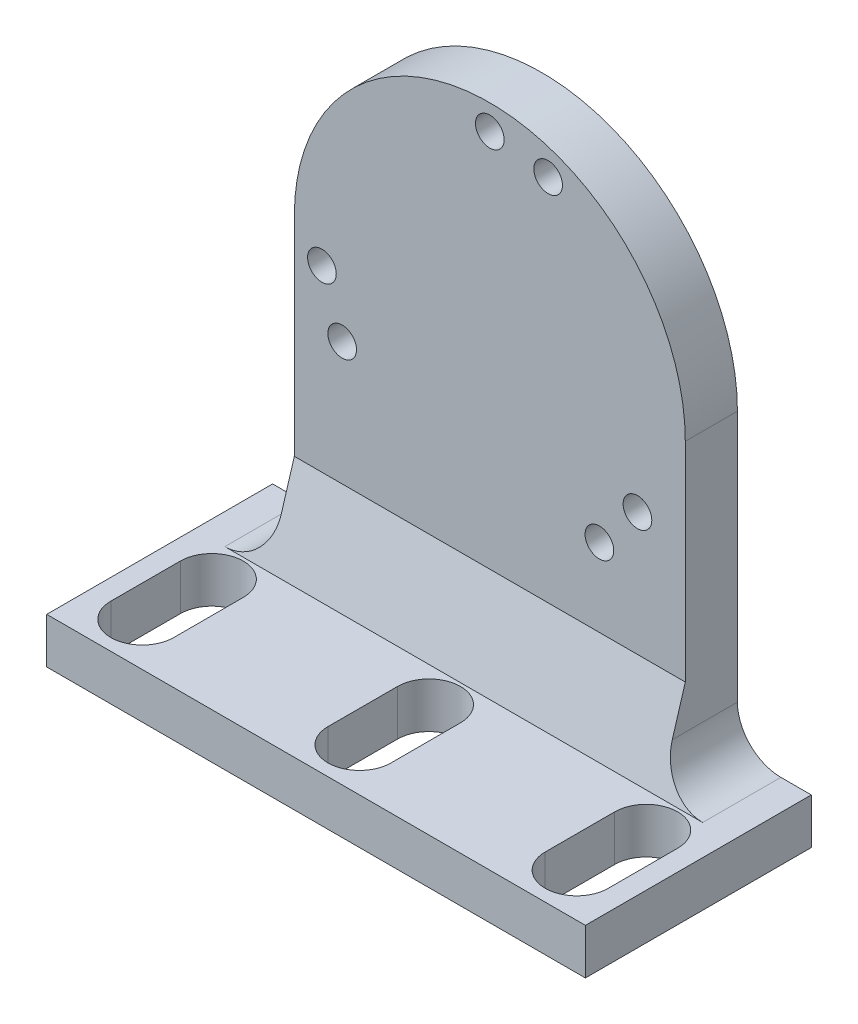
ISO-10303-21;
HEADER;
FILE_DESCRIPTION(('STEP AP214'),'2;1');
FILE_NAME('part.step','',(''),(''),'','','');
FILE_SCHEMA(('AUTOMOTIVE_DESIGN { 1 0 10303 214 1 1 1 1 }'));
ENDSEC;
DATA;
#1=APPLICATION_CONTEXT('core data for automotive mechanical design processes');
#2=APPLICATION_PROTOCOL_DEFINITION('international standard','automotive_design',2000,#1);
#3=PRODUCT_CONTEXT('',#1,'mechanical');
#4=PRODUCT('Part','Part','',(#3));
#5=PRODUCT_RELATED_PRODUCT_CATEGORY('part','',(#4));
#6=PRODUCT_DEFINITION_FORMATION('','',#4);
#7=PRODUCT_DEFINITION_CONTEXT('part definition',#1,'design');
#8=PRODUCT_DEFINITION('design','',#6,#7);
#9=PRODUCT_DEFINITION_SHAPE('','',#8);
#10=(LENGTH_UNIT() NAMED_UNIT(*) SI_UNIT(.MILLI.,.METRE.));
#11=(NAMED_UNIT(*) PLANE_ANGLE_UNIT() SI_UNIT($,.RADIAN.));
#12=(NAMED_UNIT(*) SI_UNIT($,.STERADIAN.) SOLID_ANGLE_UNIT());
#13=UNCERTAINTY_MEASURE_WITH_UNIT(LENGTH_MEASURE(1.E-05),#10,'distance_accuracy_value','');
#14=(GEOMETRIC_REPRESENTATION_CONTEXT(3) GLOBAL_UNCERTAINTY_ASSIGNED_CONTEXT((#13)) GLOBAL_UNIT_ASSIGNED_CONTEXT((#10,
#11,#12)) REPRESENTATION_CONTEXT('',''));
#15=CARTESIAN_POINT('',(0.,0.,0.));
#16=DIRECTION('',(0.,0.,1.));
#17=DIRECTION('',(1.,0.,0.));
#18=AXIS2_PLACEMENT_3D('',#15,#16,#17);
#19=CARTESIAN_POINT('',(0.,0.,6.));
#20=DIRECTION('',(0.,0.,1.));
#21=DIRECTION('',(1.,0.,0.));
#22=AXIS2_PLACEMENT_3D('',#19,#20,#21);
#23=PLANE('',#22);
#24=CARTESIAN_POINT('',(-19.3238977296041,-3.40732454218118,6.));
#25=DIRECTION('',(0.,0.,1.));
#26=DIRECTION('',(1.,0.,0.));
#27=AXIS2_PLACEMENT_3D('',#24,#25,#26);
#28=CIRCLE('',#27,1.65);
#29=CARTESIAN_POINT('',(-17.6738977296041,-3.40732454218118,6.));
#30=VERTEX_POINT('',#29);
#31=EDGE_CURVE('E208',#30,#30,#28,.T.);
#32=ORIENTED_EDGE('',*,*,#31,.F.);
#33=EDGE_LOOP('',(#32));
#34=FACE_BOUND('',#33,.T.);
#35=CARTESIAN_POINT('',(16.9931504730593,-9.81099999999897,6.));
#36=DIRECTION('',(0.,0.,1.));
#37=DIRECTION('',(1.,0.,0.));
#38=AXIS2_PLACEMENT_3D('',#35,#36,#37);
#39=CIRCLE('',#38,1.65);
#40=CARTESIAN_POINT('',(18.6431504730593,-9.81099999999897,6.));
#41=VERTEX_POINT('',#40);
#42=EDGE_CURVE('E211',#41,#41,#39,.F.);
#43=ORIENTED_EDGE('',*,*,#42,.T.);
#44=EDGE_LOOP('',(#43));
#45=FACE_BOUND('',#44,.T.);
#46=CARTESIAN_POINT('',(6.71111925233601,18.4386486050612,6.));
#47=DIRECTION('',(0.,0.,1.));
#48=DIRECTION('',(1.,0.,0.));
#49=AXIS2_PLACEMENT_3D('',#46,#47,#48);
#50=CIRCLE('',#49,1.65);
#51=CARTESIAN_POINT('',(8.36111925233601,18.4386486050612,6.));
#52=VERTEX_POINT('',#51);
#53=EDGE_CURVE('E219',#52,#52,#50,.T.);
#54=ORIENTED_EDGE('',*,*,#53,.F.);
#55=EDGE_LOOP('',(#54));
#56=FACE_BOUND('',#55,.T.);
#57=CARTESIAN_POINT('',(0.,19.622,6.));
#58=DIRECTION('',(0.,0.,1.));
#59=DIRECTION('',(1.,0.,0.));
#60=AXIS2_PLACEMENT_3D('',#57,#58,#59);
#61=CIRCLE('',#60,1.65000000000001);
#62=CARTESIAN_POINT('',(1.65,19.622,6.));
#63=VERTEX_POINT('',#62);
#64=EDGE_CURVE('E222',#63,#63,#61,.F.);
#65=ORIENTED_EDGE('',*,*,#64,.T.);
#66=EDGE_LOOP('',(#65));
#67=FACE_BOUND('',#66,.T.);
#68=CARTESIAN_POINT('',(12.6127784772705,-15.0313240628794,6.));
#69=DIRECTION('',(0.,0.,1.));
#70=DIRECTION('',(1.,0.,0.));
#71=AXIS2_PLACEMENT_3D('',#68,#69,#70);
#72=CIRCLE('',#71,1.65);
#73=CARTESIAN_POINT('',(14.2627784772705,-15.0313240628794,6.));
#74=VERTEX_POINT('',#73);
#75=EDGE_CURVE('E225',#74,#74,#72,.T.);
#76=ORIENTED_EDGE('',*,*,#75,.F.);
#77=EDGE_LOOP('',(#76));
#78=FACE_BOUND('',#77,.T.);
#79=CARTESIAN_POINT('',(-16.9931504730568,-9.8110000000004,6.));
#80=DIRECTION('',(0.,0.,1.));
#81=DIRECTION('',(1.,0.,0.));
#82=AXIS2_PLACEMENT_3D('',#79,#80,#81);
#83=CIRCLE('',#82,1.65);
#84=CARTESIAN_POINT('',(-15.3431504730568,-9.8110000000004,6.));
#85=VERTEX_POINT('',#84);
#86=EDGE_CURVE('E228',#85,#85,#83,.F.);
#87=ORIENTED_EDGE('',*,*,#86,.T.);
#88=EDGE_LOOP('',(#87));
#89=FACE_BOUND('',#88,.T.);
#90=DIRECTION('',(0.,1.,0.));
#91=VECTOR('',#90,1.);
#92=CARTESIAN_POINT('',(-22.5,0.,6.));
#93=LINE('',#92,#91);
#94=CARTESIAN_POINT('',(-22.5,-24.,6.));
#95=VERTEX_POINT('',#94);
#96=CARTESIAN_POINT('',(-22.5,0.,6.));
#97=VERTEX_POINT('',#96);
#98=EDGE_CURVE('E201',#95,#97,#93,.T.);
#99=ORIENTED_EDGE('',*,*,#98,.F.);
#100=DIRECTION('',(-1.,0.,0.));
#101=VECTOR('',#100,1.);
#102=CARTESIAN_POINT('',(22.5,-24.,6.));
#103=LINE('',#102,#101);
#104=CARTESIAN_POINT('',(22.5,-24.,6.));
#105=VERTEX_POINT('',#104);
#106=EDGE_CURVE('E190',#105,#95,#103,.T.);
#107=ORIENTED_EDGE('',*,*,#106,.F.);
#108=DIRECTION('',(0.,1.,0.));
#109=VECTOR('',#108,1.);
#110=CARTESIAN_POINT('',(22.5,0.,6.));
#111=LINE('',#110,#109);
#112=CARTESIAN_POINT('',(22.5,0.,6.));
#113=VERTEX_POINT('',#112);
#114=EDGE_CURVE('E199',#105,#113,#111,.T.);
#115=ORIENTED_EDGE('',*,*,#114,.T.);
#116=CARTESIAN_POINT('',(0.,0.,6.));
#117=DIRECTION('',(0.,0.,1.));
#118=DIRECTION('',(1.,0.,0.));
#119=AXIS2_PLACEMENT_3D('',#116,#117,#118);
#120=CIRCLE('',#119,22.5);
#121=EDGE_CURVE('E213',#97,#113,#120,.F.);
#122=ORIENTED_EDGE('',*,*,#121,.F.);
#123=EDGE_LOOP('',(#99,#107,#115,#122));
#124=FACE_BOUND('',#123,.T.);
#125=ADVANCED_FACE('F35',(#34,#45,#56,#67,#78,#89,#124),#23,.T.);
#126=CARTESIAN_POINT('',(31.,-34.,26.));
#127=DIRECTION('',(0.,-1.,0.));
#128=DIRECTION('',(1.,0.,0.));
#129=AXIS2_PLACEMENT_3D('',#126,#127,#128);
#130=PLANE('',#129);
#131=DIRECTION('',(0.,0.,-1.));
#132=VECTOR('',#131,1.);
#133=CARTESIAN_POINT('',(3.625,-34.,21.));
#134=LINE('',#133,#132);
#135=CARTESIAN_POINT('',(3.625,-34.,21.));
#136=VERTEX_POINT('',#135);
#137=CARTESIAN_POINT('',(3.625,-34.,13.));
#138=VERTEX_POINT('',#137);
#139=EDGE_CURVE('E343',#136,#138,#134,.T.);
#140=ORIENTED_EDGE('',*,*,#139,.F.);
#141=CARTESIAN_POINT('',(0.,-34.,21.));
#142=DIRECTION('',(0.,1.,0.));
#143=DIRECTION('',(-1.,0.,0.));
#144=AXIS2_PLACEMENT_3D('',#141,#142,#143);
#145=CIRCLE('',#144,3.625);
#146=CARTESIAN_POINT('',(-3.625,-34.,21.));
#147=VERTEX_POINT('',#146);
#148=EDGE_CURVE('E346',#147,#136,#145,.T.);
#149=ORIENTED_EDGE('',*,*,#148,.F.);
#150=DIRECTION('',(0.,0.,1.));
#151=VECTOR('',#150,1.);
#152=CARTESIAN_POINT('',(-3.625,-34.,21.));
#153=LINE('',#152,#151);
#154=CARTESIAN_POINT('',(-3.625,-34.,13.));
#155=VERTEX_POINT('',#154);
#156=EDGE_CURVE('E336',#155,#147,#153,.T.);
#157=ORIENTED_EDGE('',*,*,#156,.F.);
#158=CARTESIAN_POINT('',(0.,-34.,13.));
#159=DIRECTION('',(0.,1.,0.));
#160=DIRECTION('',(-1.,0.,0.));
#161=AXIS2_PLACEMENT_3D('',#158,#159,#160);
#162=CIRCLE('',#161,3.625);
#163=EDGE_CURVE('E340',#138,#155,#162,.T.);
#164=ORIENTED_EDGE('',*,*,#163,.F.);
#165=EDGE_LOOP('',(#140,#149,#157,#164));
#166=FACE_BOUND('',#165,.T.);
#167=DIRECTION('',(0.,0.,-1.));
#168=VECTOR('',#167,1.);
#169=CARTESIAN_POINT('',(-21.375,-34.,21.));
#170=LINE('',#169,#168);
#171=CARTESIAN_POINT('',(-21.375,-34.,21.));
#172=VERTEX_POINT('',#171);
#173=CARTESIAN_POINT('',(-21.375,-34.,13.));
#174=VERTEX_POINT('',#173);
#175=EDGE_CURVE('E377',#172,#174,#170,.T.);
#176=ORIENTED_EDGE('',*,*,#175,.F.);
#177=CARTESIAN_POINT('',(-25.,-34.,21.));
#178=DIRECTION('',(0.,1.,0.));
#179=DIRECTION('',(-1.,0.,0.));
#180=AXIS2_PLACEMENT_3D('',#177,#178,#179);
#181=CIRCLE('',#180,3.62500000000001);
#182=CARTESIAN_POINT('',(-28.625,-34.,21.));
#183=VERTEX_POINT('',#182);
#184=EDGE_CURVE('E202',#183,#172,#181,.T.);
#185=ORIENTED_EDGE('',*,*,#184,.F.);
#186=DIRECTION('',(0.,0.,1.));
#187=VECTOR('',#186,1.);
#188=CARTESIAN_POINT('',(-28.625,-34.,21.));
#189=LINE('',#188,#187);
#190=CARTESIAN_POINT('',(-28.625,-34.,13.));
#191=VERTEX_POINT('',#190);
#192=EDGE_CURVE('E370',#191,#183,#189,.T.);
#193=ORIENTED_EDGE('',*,*,#192,.F.);
#194=CARTESIAN_POINT('',(-25.,-34.,13.));
#195=DIRECTION('',(0.,1.,0.));
#196=DIRECTION('',(-1.,0.,0.));
#197=AXIS2_PLACEMENT_3D('',#194,#195,#196);
#198=CIRCLE('',#197,3.62500000000001);
#199=EDGE_CURVE('E374',#174,#191,#198,.T.);
#200=ORIENTED_EDGE('',*,*,#199,.F.);
#201=EDGE_LOOP('',(#176,#185,#193,#200));
#202=FACE_BOUND('',#201,.T.);
#203=DIRECTION('',(0.,0.,-1.));
#204=VECTOR('',#203,1.);
#205=CARTESIAN_POINT('',(28.625,-34.,21.));
#206=LINE('',#205,#204);
#207=CARTESIAN_POINT('',(28.625,-34.,21.));
#208=VERTEX_POINT('',#207);
#209=CARTESIAN_POINT('',(28.625,-34.,13.));
#210=VERTEX_POINT('',#209);
#211=EDGE_CURVE('E407',#208,#210,#206,.T.);
#212=ORIENTED_EDGE('',*,*,#211,.F.);
#213=CARTESIAN_POINT('',(25.,-34.,21.));
#214=DIRECTION('',(0.,1.,0.));
#215=DIRECTION('',(-1.,0.,0.));
#216=AXIS2_PLACEMENT_3D('',#213,#214,#215);
#217=CIRCLE('',#216,3.625);
#218=CARTESIAN_POINT('',(21.375,-34.,21.));
#219=VERTEX_POINT('',#218);
#220=EDGE_CURVE('E369',#219,#208,#217,.T.);
#221=ORIENTED_EDGE('',*,*,#220,.F.);
#222=DIRECTION('',(0.,0.,1.));
#223=VECTOR('',#222,1.);
#224=CARTESIAN_POINT('',(21.375,-34.,21.));
#225=LINE('',#224,#223);
#226=CARTESIAN_POINT('',(21.375,-34.,13.));
#227=VERTEX_POINT('',#226);
#228=EDGE_CURVE('E400',#227,#219,#225,.T.);
#229=ORIENTED_EDGE('',*,*,#228,.F.);
#230=CARTESIAN_POINT('',(25.,-34.,13.));
#231=DIRECTION('',(0.,1.,0.));
#232=DIRECTION('',(-1.,0.,0.));
#233=AXIS2_PLACEMENT_3D('',#230,#231,#232);
#234=CIRCLE('',#233,3.625);
#235=EDGE_CURVE('E404',#210,#227,#234,.T.);
#236=ORIENTED_EDGE('',*,*,#235,.F.);
#237=EDGE_LOOP('',(#212,#221,#229,#236));
#238=FACE_BOUND('',#237,.T.);
#239=DIRECTION('',(-1.,0.,0.));
#240=VECTOR('',#239,1.);
#241=CARTESIAN_POINT('',(22.5,-34.,9.));
#242=LINE('',#241,#240);
#243=CARTESIAN_POINT('',(27.5,-34.,9.));
#244=VERTEX_POINT('',#243);
#245=CARTESIAN_POINT('',(-27.5,-34.,9.));
#246=VERTEX_POINT('',#245);
#247=EDGE_CURVE('E194',#244,#246,#242,.T.);
#248=ORIENTED_EDGE('',*,*,#247,.T.);
#249=DIRECTION('',(0.,0.,-1.));
#250=VECTOR('',#249,1.);
#251=CARTESIAN_POINT('',(-27.5,-34.,26.));
#252=LINE('',#251,#250);
#253=CARTESIAN_POINT('',(-27.5,-34.,0.));
#254=VERTEX_POINT('',#253);
#255=EDGE_CURVE('E264',#246,#254,#252,.T.);
#256=ORIENTED_EDGE('',*,*,#255,.T.);
#257=DIRECTION('',(-1.,0.,0.));
#258=VECTOR('',#257,1.);
#259=CARTESIAN_POINT('',(31.,-34.,0.));
#260=LINE('',#259,#258);
#261=CARTESIAN_POINT('',(-31.,-34.,0.));
#262=VERTEX_POINT('',#261);
#263=EDGE_CURVE('E290',#254,#262,#260,.T.);
#264=ORIENTED_EDGE('',*,*,#263,.T.);
#265=DIRECTION('',(0.,0.,-1.));
#266=VECTOR('',#265,1.);
#267=CARTESIAN_POINT('',(-31.,-34.,26.));
#268=LINE('',#267,#266);
#269=CARTESIAN_POINT('',(-31.,-34.,26.));
#270=VERTEX_POINT('',#269);
#271=EDGE_CURVE('E308',#270,#262,#268,.T.);
#272=ORIENTED_EDGE('',*,*,#271,.F.);
#273=DIRECTION('',(-1.,0.,0.));
#274=VECTOR('',#273,1.);
#275=CARTESIAN_POINT('',(31.,-34.,26.));
#276=LINE('',#275,#274);
#277=CARTESIAN_POINT('',(31.,-34.,26.));
#278=VERTEX_POINT('',#277);
#279=EDGE_CURVE('E310',#278,#270,#276,.T.);
#280=ORIENTED_EDGE('',*,*,#279,.F.);
#281=DIRECTION('',(0.,0.,-1.));
#282=VECTOR('',#281,1.);
#283=CARTESIAN_POINT('',(31.,-34.,26.));
#284=LINE('',#283,#282);
#285=CARTESIAN_POINT('',(31.,-34.,0.));
#286=VERTEX_POINT('',#285);
#287=EDGE_CURVE('E288',#278,#286,#284,.T.);
#288=ORIENTED_EDGE('',*,*,#287,.T.);
#289=CARTESIAN_POINT('',(27.5,-34.,0.));
#290=VERTEX_POINT('',#289);
#291=EDGE_CURVE('E282',#286,#290,#260,.T.);
#292=ORIENTED_EDGE('',*,*,#291,.T.);
#293=DIRECTION('',(0.,0.,-1.));
#294=VECTOR('',#293,1.);
#295=CARTESIAN_POINT('',(27.5,-34.,9.));
#296=LINE('',#295,#294);
#297=EDGE_CURVE('E261',#290,#244,#296,.F.);
#298=ORIENTED_EDGE('',*,*,#297,.T.);
#299=EDGE_LOOP('',(#248,#256,#264,#272,#280,#288,#292,#298));
#300=FACE_BOUND('',#299,.T.);
#301=ADVANCED_FACE('F285',(#166,#202,#238,#300),#130,.F.);
#302=CARTESIAN_POINT('',(0.,0.,6.));
#303=DIRECTION('',(0.,0.,-1.));
#304=DIRECTION('',(-1.,0.,0.));
#305=AXIS2_PLACEMENT_3D('',#302,#303,#304);
#306=CYLINDRICAL_SURFACE('',#305,22.5);
#307=CARTESIAN_POINT('',(0.,0.,0.));
#308=DIRECTION('',(0.,0.,1.));
#309=DIRECTION('',(1.,0.,0.));
#310=AXIS2_PLACEMENT_3D('',#307,#308,#309);
#311=CIRCLE('',#310,22.5);
#312=CARTESIAN_POINT('',(-22.5,0.,0.));
#313=VERTEX_POINT('',#312);
#314=CARTESIAN_POINT('',(22.5,0.,0.));
#315=VERTEX_POINT('',#314);
#316=EDGE_CURVE('E231',#313,#315,#311,.F.);
#317=ORIENTED_EDGE('',*,*,#316,.F.);
#318=DIRECTION('',(0.,0.,-1.));
#319=VECTOR('',#318,1.);
#320=CARTESIAN_POINT('',(-22.5,0.,6.));
#321=LINE('',#320,#319);
#322=EDGE_CURVE('E258',#97,#313,#321,.T.);
#323=ORIENTED_EDGE('',*,*,#322,.F.);
#324=ORIENTED_EDGE('',*,*,#121,.T.);
#325=DIRECTION('',(0.,0.,-1.));
#326=VECTOR('',#325,1.);
#327=CARTESIAN_POINT('',(22.5,0.,6.));
#328=LINE('',#327,#326);
#329=EDGE_CURVE('E206',#113,#315,#328,.T.);
#330=ORIENTED_EDGE('',*,*,#329,.T.);
#331=EDGE_LOOP('',(#317,#323,#324,#330));
#332=FACE_BOUND('',#331,.T.);
#333=ADVANCED_FACE('F294',(#332),#306,.T.);
#334=CARTESIAN_POINT('',(-22.5,0.,6.));
#335=DIRECTION('',(-1.,0.,0.));
#336=DIRECTION('',(0.,0.,1.));
#337=AXIS2_PLACEMENT_3D('',#334,#335,#336);
#338=PLANE('',#337);
#339=DIRECTION('',(0.,1.,0.));
#340=VECTOR('',#339,1.);
#341=CARTESIAN_POINT('',(-22.5,0.,0.));
#342=LINE('',#341,#340);
#343=CARTESIAN_POINT('',(-22.5,-29.,0.));
#344=VERTEX_POINT('',#343);
#345=EDGE_CURVE('E234',#344,#313,#342,.T.);
#346=ORIENTED_EDGE('',*,*,#345,.F.);
#347=DIRECTION('',(0.,0.,-1.));
#348=VECTOR('',#347,1.);
#349=CARTESIAN_POINT('',(-22.5,-29.,6.));
#350=LINE('',#349,#348);
#351=CARTESIAN_POINT('',(-22.5,-29.,7.5));
#352=VERTEX_POINT('',#351);
#353=EDGE_CURVE('E267',#344,#352,#350,.F.);
#354=ORIENTED_EDGE('',*,*,#353,.T.);
#355=DIRECTION('',(0.,-0.957826285221151,0.287347885566345));
#356=VECTOR('',#355,1.);
#357=CARTESIAN_POINT('',(-22.5,-24.,6.));
#358=LINE('',#357,#356);
#359=EDGE_CURVE('E195',#95,#352,#358,.T.);
#360=ORIENTED_EDGE('',*,*,#359,.F.);
#361=ORIENTED_EDGE('',*,*,#98,.T.);
#362=ORIENTED_EDGE('',*,*,#322,.T.);
#363=EDGE_LOOP('',(#346,#354,#360,#361,#362));
#364=FACE_BOUND('',#363,.T.);
#365=ADVANCED_FACE('F300',(#364),#338,.T.);
#366=CARTESIAN_POINT('',(12.6127784772705,-15.0313240628794,6.));
#367=DIRECTION('',(0.,0.,-1.));
#368=DIRECTION('',(-1.,0.,0.));
#369=AXIS2_PLACEMENT_3D('',#366,#367,#368);
#370=CYLINDRICAL_SURFACE('',#369,1.65);
#371=ORIENTED_EDGE('',*,*,#75,.T.);
#372=EDGE_LOOP('',(#371));
#373=FACE_BOUND('',#372,.T.);
#374=CARTESIAN_POINT('',(12.6127784772705,-15.0313240628794,0.));
#375=DIRECTION('',(0.,0.,1.));
#376=DIRECTION('',(1.,0.,0.));
#377=AXIS2_PLACEMENT_3D('',#374,#375,#376);
#378=CIRCLE('',#377,1.65);
#379=CARTESIAN_POINT('',(14.2627784772705,-15.0313240628794,0.));
#380=VERTEX_POINT('',#379);
#381=EDGE_CURVE('E251',#380,#380,#378,.T.);
#382=ORIENTED_EDGE('',*,*,#381,.F.);
#383=EDGE_LOOP('',(#382));
#384=FACE_BOUND('',#383,.T.);
#385=ADVANCED_FACE('F467',(#373,#384),#370,.F.);
#386=CARTESIAN_POINT('',(0.,19.622,6.));
#387=DIRECTION('',(0.,0.,-1.));
#388=DIRECTION('',(-1.,0.,0.));
#389=AXIS2_PLACEMENT_3D('',#386,#387,#388);
#390=CYLINDRICAL_SURFACE('',#389,1.65000000000001);
#391=ORIENTED_EDGE('',*,*,#64,.F.);
#392=EDGE_LOOP('',(#391));
#393=FACE_BOUND('',#392,.T.);
#394=CARTESIAN_POINT('',(0.,19.622,0.));
#395=DIRECTION('',(0.,0.,1.));
#396=DIRECTION('',(1.,0.,0.));
#397=AXIS2_PLACEMENT_3D('',#394,#395,#396);
#398=CIRCLE('',#397,1.65000000000001);
#399=CARTESIAN_POINT('',(1.65,19.622,0.));
#400=VERTEX_POINT('',#399);
#401=EDGE_CURVE('E248',#400,#400,#398,.F.);
#402=ORIENTED_EDGE('',*,*,#401,.T.);
#403=EDGE_LOOP('',(#402));
#404=FACE_BOUND('',#403,.T.);
#405=ADVANCED_FACE('F470',(#393,#404),#390,.F.);
#406=CARTESIAN_POINT('',(6.71111925233601,18.4386486050612,6.));
#407=DIRECTION('',(0.,0.,-1.));
#408=DIRECTION('',(-1.,0.,0.));
#409=AXIS2_PLACEMENT_3D('',#406,#407,#408);
#410=CYLINDRICAL_SURFACE('',#409,1.65);
#411=ORIENTED_EDGE('',*,*,#53,.T.);
#412=EDGE_LOOP('',(#411));
#413=FACE_BOUND('',#412,.T.);
#414=CARTESIAN_POINT('',(6.71111925233601,18.4386486050612,0.));
#415=DIRECTION('',(0.,0.,1.));
#416=DIRECTION('',(1.,0.,0.));
#417=AXIS2_PLACEMENT_3D('',#414,#415,#416);
#418=CIRCLE('',#417,1.65);
#419=CARTESIAN_POINT('',(8.36111925233601,18.4386486050612,0.));
#420=VERTEX_POINT('',#419);
#421=EDGE_CURVE('E245',#420,#420,#418,.T.);
#422=ORIENTED_EDGE('',*,*,#421,.F.);
#423=EDGE_LOOP('',(#422));
#424=FACE_BOUND('',#423,.T.);
#425=ADVANCED_FACE('F474',(#413,#424),#410,.F.);
#426=CARTESIAN_POINT('',(16.9931504730593,-9.81099999999897,6.));
#427=DIRECTION('',(0.,0.,-1.));
#428=DIRECTION('',(-1.,0.,0.));
#429=AXIS2_PLACEMENT_3D('',#426,#427,#428);
#430=CYLINDRICAL_SURFACE('',#429,1.65);
#431=ORIENTED_EDGE('',*,*,#42,.F.);
#432=EDGE_LOOP('',(#431));
#433=FACE_BOUND('',#432,.T.);
#434=CARTESIAN_POINT('',(16.9931504730593,-9.81099999999897,0.));
#435=DIRECTION('',(0.,0.,1.));
#436=DIRECTION('',(1.,0.,0.));
#437=AXIS2_PLACEMENT_3D('',#434,#435,#436);
#438=CIRCLE('',#437,1.65);
#439=CARTESIAN_POINT('',(18.6431504730593,-9.81099999999897,0.));
#440=VERTEX_POINT('',#439);
#441=EDGE_CURVE('E242',#440,#440,#438,.F.);
#442=ORIENTED_EDGE('',*,*,#441,.T.);
#443=EDGE_LOOP('',(#442));
#444=FACE_BOUND('',#443,.T.);
#445=ADVANCED_FACE('F478',(#433,#444),#430,.F.);
#446=CARTESIAN_POINT('',(-19.3238977296041,-3.40732454218118,6.));
#447=DIRECTION('',(0.,0.,-1.));
#448=DIRECTION('',(-1.,0.,0.));
#449=AXIS2_PLACEMENT_3D('',#446,#447,#448);
#450=CYLINDRICAL_SURFACE('',#449,1.65);
#451=ORIENTED_EDGE('',*,*,#31,.T.);
#452=EDGE_LOOP('',(#451));
#453=FACE_BOUND('',#452,.T.);
#454=CARTESIAN_POINT('',(-19.3238977296041,-3.40732454218118,0.));
#455=DIRECTION('',(0.,0.,1.));
#456=DIRECTION('',(1.,0.,0.));
#457=AXIS2_PLACEMENT_3D('',#454,#455,#456);
#458=CIRCLE('',#457,1.65);
#459=CARTESIAN_POINT('',(-17.6738977296041,-3.40732454218118,0.));
#460=VERTEX_POINT('',#459);
#461=EDGE_CURVE('E239',#460,#460,#458,.T.);
#462=ORIENTED_EDGE('',*,*,#461,.F.);
#463=EDGE_LOOP('',(#462));
#464=FACE_BOUND('',#463,.T.);
#465=ADVANCED_FACE('F482',(#453,#464),#450,.F.);
#466=CARTESIAN_POINT('',(22.5,0.,6.));
#467=DIRECTION('',(-1.,0.,0.));
#468=DIRECTION('',(0.,-1.,0.));
#469=AXIS2_PLACEMENT_3D('',#466,#467,#468);
#470=PLANE('',#469);
#471=DIRECTION('',(0.,-0.957826285221151,0.287347885566345));
#472=VECTOR('',#471,1.);
#473=CARTESIAN_POINT('',(22.5,-24.,6.));
#474=LINE('',#473,#472);
#475=CARTESIAN_POINT('',(22.5,-29.,7.5));
#476=VERTEX_POINT('',#475);
#477=EDGE_CURVE('E186',#105,#476,#474,.T.);
#478=ORIENTED_EDGE('',*,*,#477,.T.);
#479=DIRECTION('',(0.,0.,-1.));
#480=VECTOR('',#479,1.);
#481=CARTESIAN_POINT('',(22.5,-29.,0.));
#482=LINE('',#481,#480);
#483=CARTESIAN_POINT('',(22.5,-29.,0.));
#484=VERTEX_POINT('',#483);
#485=EDGE_CURVE('E269',#476,#484,#482,.T.);
#486=ORIENTED_EDGE('',*,*,#485,.T.);
#487=DIRECTION('',(0.,1.,0.));
#488=VECTOR('',#487,1.);
#489=CARTESIAN_POINT('',(22.5,0.,0.));
#490=LINE('',#489,#488);
#491=EDGE_CURVE('E237',#484,#315,#490,.T.);
#492=ORIENTED_EDGE('',*,*,#491,.T.);
#493=ORIENTED_EDGE('',*,*,#329,.F.);
#494=ORIENTED_EDGE('',*,*,#114,.F.);
#495=EDGE_LOOP('',(#478,#486,#492,#493,#494));
#496=FACE_BOUND('',#495,.T.);
#497=ADVANCED_FACE('F204',(#496),#470,.F.);
#498=CARTESIAN_POINT('',(-16.9931504730568,-9.8110000000004,6.));
#499=DIRECTION('',(0.,0.,-1.));
#500=DIRECTION('',(-1.,0.,0.));
#501=AXIS2_PLACEMENT_3D('',#498,#499,#500);
#502=CYLINDRICAL_SURFACE('',#501,1.65);
#503=ORIENTED_EDGE('',*,*,#86,.F.);
#504=EDGE_LOOP('',(#503));
#505=FACE_BOUND('',#504,.T.);
#506=CARTESIAN_POINT('',(-16.9931504730568,-9.8110000000004,0.));
#507=DIRECTION('',(0.,0.,1.));
#508=DIRECTION('',(1.,0.,0.));
#509=AXIS2_PLACEMENT_3D('',#506,#507,#508);
#510=CIRCLE('',#509,1.65);
#511=CARTESIAN_POINT('',(-15.3431504730568,-9.8110000000004,0.));
#512=VERTEX_POINT('',#511);
#513=EDGE_CURVE('E254',#512,#512,#510,.F.);
#514=ORIENTED_EDGE('',*,*,#513,.T.);
#515=EDGE_LOOP('',(#514));
#516=FACE_BOUND('',#515,.T.);
#517=ADVANCED_FACE('F463',(#505,#516),#502,.F.);
#518=CARTESIAN_POINT('',(0.,0.,0.));
#519=DIRECTION('',(0.,0.,1.));
#520=DIRECTION('',(1.,0.,0.));
#521=AXIS2_PLACEMENT_3D('',#518,#519,#520);
#522=PLANE('',#521);
#523=ORIENTED_EDGE('',*,*,#316,.T.);
#524=ORIENTED_EDGE('',*,*,#491,.F.);
#525=CARTESIAN_POINT('',(27.5,-29.,0.));
#526=DIRECTION('',(0.,0.,1.));
#527=DIRECTION('',(1.,0.,0.));
#528=AXIS2_PLACEMENT_3D('',#525,#526,#527);
#529=CIRCLE('',#528,5.);
#530=EDGE_CURVE('E43',#484,#290,#529,.T.);
#531=ORIENTED_EDGE('',*,*,#530,.T.);
#532=ORIENTED_EDGE('',*,*,#291,.F.);
#533=DIRECTION('',(0.,1.,0.));
#534=VECTOR('',#533,1.);
#535=CARTESIAN_POINT('',(31.,-39.25,0.));
#536=LINE('',#535,#534);
#537=CARTESIAN_POINT('',(31.,-39.25,0.));
#538=VERTEX_POINT('',#537);
#539=EDGE_CURVE('E312',#538,#286,#536,.T.);
#540=ORIENTED_EDGE('',*,*,#539,.F.);
#541=DIRECTION('',(1.,0.,0.));
#542=VECTOR('',#541,1.);
#543=CARTESIAN_POINT('',(31.,-39.25,0.));
#544=LINE('',#543,#542);
#545=CARTESIAN_POINT('',(-31.,-39.25,0.));
#546=VERTEX_POINT('',#545);
#547=EDGE_CURVE('E314',#546,#538,#544,.T.);
#548=ORIENTED_EDGE('',*,*,#547,.F.);
#549=DIRECTION('',(0.,-1.,0.));
#550=VECTOR('',#549,1.);
#551=CARTESIAN_POINT('',(-31.,-39.25,0.));
#552=LINE('',#551,#550);
#553=EDGE_CURVE('E316',#262,#546,#552,.T.);
#554=ORIENTED_EDGE('',*,*,#553,.F.);
#555=ORIENTED_EDGE('',*,*,#263,.F.);
#556=CARTESIAN_POINT('',(-27.5,-29.,0.));
#557=DIRECTION('',(0.,0.,1.));
#558=DIRECTION('',(1.,0.,0.));
#559=AXIS2_PLACEMENT_3D('',#556,#557,#558);
#560=CIRCLE('',#559,5.);
#561=EDGE_CURVE('E271',#254,#344,#560,.T.);
#562=ORIENTED_EDGE('',*,*,#561,.T.);
#563=ORIENTED_EDGE('',*,*,#345,.T.);
#564=EDGE_LOOP('',(#523,#524,#531,#532,#540,#548,#554,#555,#562,#563));
#565=FACE_BOUND('',#564,.T.);
#566=ORIENTED_EDGE('',*,*,#461,.T.);
#567=EDGE_LOOP('',(#566));
#568=FACE_BOUND('',#567,.T.);
#569=ORIENTED_EDGE('',*,*,#441,.F.);
#570=EDGE_LOOP('',(#569));
#571=FACE_BOUND('',#570,.T.);
#572=ORIENTED_EDGE('',*,*,#421,.T.);
#573=EDGE_LOOP('',(#572));
#574=FACE_BOUND('',#573,.T.);
#575=ORIENTED_EDGE('',*,*,#401,.F.);
#576=EDGE_LOOP('',(#575));
#577=FACE_BOUND('',#576,.T.);
#578=ORIENTED_EDGE('',*,*,#381,.T.);
#579=EDGE_LOOP('',(#578));
#580=FACE_BOUND('',#579,.T.);
#581=ORIENTED_EDGE('',*,*,#513,.F.);
#582=EDGE_LOOP('',(#581));
#583=FACE_BOUND('',#582,.T.);
#584=ADVANCED_FACE('F279',(#565,#568,#571,#574,#577,#580,#583),#522,.F.);
#585=CARTESIAN_POINT('',(-31.,-39.25,26.));
#586=DIRECTION('',(1.,0.,0.));
#587=DIRECTION('',(0.,0.,-1.));
#588=AXIS2_PLACEMENT_3D('',#585,#586,#587);
#589=PLANE('',#588);
#590=ORIENTED_EDGE('',*,*,#553,.T.);
#591=DIRECTION('',(0.,0.,-1.));
#592=VECTOR('',#591,1.);
#593=CARTESIAN_POINT('',(-31.,-39.25,26.));
#594=LINE('',#593,#592);
#595=CARTESIAN_POINT('',(-31.,-39.25,26.));
#596=VERTEX_POINT('',#595);
#597=EDGE_CURVE('E235',#596,#546,#594,.T.);
#598=ORIENTED_EDGE('',*,*,#597,.F.);
#599=DIRECTION('',(0.,-1.,0.));
#600=VECTOR('',#599,1.);
#601=CARTESIAN_POINT('',(-31.,-39.25,26.));
#602=LINE('',#601,#600);
#603=EDGE_CURVE('E289',#270,#596,#602,.T.);
#604=ORIENTED_EDGE('',*,*,#603,.F.);
#605=ORIENTED_EDGE('',*,*,#271,.T.);
#606=EDGE_LOOP('',(#590,#598,#604,#605));
#607=FACE_BOUND('',#606,.T.);
#608=ADVANCED_FACE('F430',(#607),#589,.F.);
#609=CARTESIAN_POINT('',(31.,-39.25,26.));
#610=DIRECTION('',(0.,1.,0.));
#611=DIRECTION('',(-1.,0.,0.));
#612=AXIS2_PLACEMENT_3D('',#609,#610,#611);
#613=PLANE('',#612);
#614=DIRECTION('',(0.,0.,1.));
#615=VECTOR('',#614,1.);
#616=CARTESIAN_POINT('',(21.375,-39.25,21.));
#617=LINE('',#616,#615);
#618=CARTESIAN_POINT('',(21.375,-39.25,13.));
#619=VERTEX_POINT('',#618);
#620=CARTESIAN_POINT('',(21.375,-39.25,21.));
#621=VERTEX_POINT('',#620);
#622=EDGE_CURVE('E395',#619,#621,#617,.T.);
#623=ORIENTED_EDGE('',*,*,#622,.T.);
#624=CARTESIAN_POINT('',(25.,-39.25,21.));
#625=DIRECTION('',(0.,1.,0.));
#626=DIRECTION('',(-1.,0.,0.));
#627=AXIS2_PLACEMENT_3D('',#624,#625,#626);
#628=CIRCLE('',#627,3.625);
#629=CARTESIAN_POINT('',(28.625,-39.25,21.));
#630=VERTEX_POINT('',#629);
#631=EDGE_CURVE('E403',#621,#630,#628,.T.);
#632=ORIENTED_EDGE('',*,*,#631,.T.);
#633=DIRECTION('',(0.,0.,-1.));
#634=VECTOR('',#633,1.);
#635=CARTESIAN_POINT('',(28.625,-39.25,21.));
#636=LINE('',#635,#634);
#637=CARTESIAN_POINT('',(28.625,-39.25,13.));
#638=VERTEX_POINT('',#637);
#639=EDGE_CURVE('E416',#630,#638,#636,.T.);
#640=ORIENTED_EDGE('',*,*,#639,.T.);
#641=CARTESIAN_POINT('',(25.,-39.25,13.));
#642=DIRECTION('',(0.,1.,0.));
#643=DIRECTION('',(-1.,0.,0.));
#644=AXIS2_PLACEMENT_3D('',#641,#642,#643);
#645=CIRCLE('',#644,3.625);
#646=EDGE_CURVE('E413',#638,#619,#645,.T.);
#647=ORIENTED_EDGE('',*,*,#646,.T.);
#648=EDGE_LOOP('',(#623,#632,#640,#647));
#649=FACE_BOUND('',#648,.T.);
#650=DIRECTION('',(0.,0.,1.));
#651=VECTOR('',#650,1.);
#652=CARTESIAN_POINT('',(-28.625,-39.25,21.));
#653=LINE('',#652,#651);
#654=CARTESIAN_POINT('',(-28.625,-39.25,13.));
#655=VERTEX_POINT('',#654);
#656=CARTESIAN_POINT('',(-28.625,-39.25,21.));
#657=VERTEX_POINT('',#656);
#658=EDGE_CURVE('E363',#655,#657,#653,.T.);
#659=ORIENTED_EDGE('',*,*,#658,.T.);
#660=CARTESIAN_POINT('',(-25.,-39.25,21.));
#661=DIRECTION('',(0.,1.,0.));
#662=DIRECTION('',(-1.,0.,0.));
#663=AXIS2_PLACEMENT_3D('',#660,#661,#662);
#664=CIRCLE('',#663,3.62500000000001);
#665=CARTESIAN_POINT('',(-21.375,-39.25,21.));
#666=VERTEX_POINT('',#665);
#667=EDGE_CURVE('E373',#657,#666,#664,.T.);
#668=ORIENTED_EDGE('',*,*,#667,.T.);
#669=DIRECTION('',(0.,0.,-1.));
#670=VECTOR('',#669,1.);
#671=CARTESIAN_POINT('',(-21.375,-39.25,21.));
#672=LINE('',#671,#670);
#673=CARTESIAN_POINT('',(-21.375,-39.25,13.));
#674=VERTEX_POINT('',#673);
#675=EDGE_CURVE('E386',#666,#674,#672,.T.);
#676=ORIENTED_EDGE('',*,*,#675,.T.);
#677=CARTESIAN_POINT('',(-25.,-39.25,13.));
#678=DIRECTION('',(0.,1.,0.));
#679=DIRECTION('',(-1.,0.,0.));
#680=AXIS2_PLACEMENT_3D('',#677,#678,#679);
#681=CIRCLE('',#680,3.62500000000001);
#682=EDGE_CURVE('E383',#674,#655,#681,.T.);
#683=ORIENTED_EDGE('',*,*,#682,.T.);
#684=EDGE_LOOP('',(#659,#668,#676,#683));
#685=FACE_BOUND('',#684,.T.);
#686=DIRECTION('',(0.,0.,1.));
#687=VECTOR('',#686,1.);
#688=CARTESIAN_POINT('',(-3.625,-39.25,21.));
#689=LINE('',#688,#687);
#690=CARTESIAN_POINT('',(-3.625,-39.25,13.));
#691=VERTEX_POINT('',#690);
#692=CARTESIAN_POINT('',(-3.625,-39.25,21.));
#693=VERTEX_POINT('',#692);
#694=EDGE_CURVE('E331',#691,#693,#689,.T.);
#695=ORIENTED_EDGE('',*,*,#694,.T.);
#696=CARTESIAN_POINT('',(0.,-39.25,21.));
#697=DIRECTION('',(0.,1.,0.));
#698=DIRECTION('',(-1.,0.,0.));
#699=AXIS2_PLACEMENT_3D('',#696,#697,#698);
#700=CIRCLE('',#699,3.625);
#701=CARTESIAN_POINT('',(3.625,-39.25,21.));
#702=VERTEX_POINT('',#701);
#703=EDGE_CURVE('E339',#693,#702,#700,.T.);
#704=ORIENTED_EDGE('',*,*,#703,.T.);
#705=DIRECTION('',(0.,0.,-1.));
#706=VECTOR('',#705,1.);
#707=CARTESIAN_POINT('',(3.625,-39.25,21.));
#708=LINE('',#707,#706);
#709=CARTESIAN_POINT('',(3.625,-39.25,13.));
#710=VERTEX_POINT('',#709);
#711=EDGE_CURVE('E354',#702,#710,#708,.T.);
#712=ORIENTED_EDGE('',*,*,#711,.T.);
#713=CARTESIAN_POINT('',(0.,-39.25,13.));
#714=DIRECTION('',(0.,1.,0.));
#715=DIRECTION('',(-1.,0.,0.));
#716=AXIS2_PLACEMENT_3D('',#713,#714,#715);
#717=CIRCLE('',#716,3.625);
#718=EDGE_CURVE('E351',#710,#691,#717,.T.);
#719=ORIENTED_EDGE('',*,*,#718,.T.);
#720=EDGE_LOOP('',(#695,#704,#712,#719));
#721=FACE_BOUND('',#720,.T.);
#722=ORIENTED_EDGE('',*,*,#547,.T.);
#723=DIRECTION('',(0.,0.,-1.));
#724=VECTOR('',#723,1.);
#725=CARTESIAN_POINT('',(31.,-39.25,26.));
#726=LINE('',#725,#724);
#727=CARTESIAN_POINT('',(31.,-39.25,26.));
#728=VERTEX_POINT('',#727);
#729=EDGE_CURVE('E304',#728,#538,#726,.T.);
#730=ORIENTED_EDGE('',*,*,#729,.F.);
#731=DIRECTION('',(1.,0.,0.));
#732=VECTOR('',#731,1.);
#733=CARTESIAN_POINT('',(31.,-39.25,26.));
#734=LINE('',#733,#732);
#735=EDGE_CURVE('E323',#596,#728,#734,.T.);
#736=ORIENTED_EDGE('',*,*,#735,.F.);
#737=ORIENTED_EDGE('',*,*,#597,.T.);
#738=EDGE_LOOP('',(#722,#730,#736,#737));
#739=FACE_BOUND('',#738,.T.);
#740=ADVANCED_FACE('F439',(#649,#685,#721,#739),#613,.F.);
#741=CARTESIAN_POINT('',(31.,-39.25,26.));
#742=DIRECTION('',(-1.,0.,0.));
#743=DIRECTION('',(0.,0.,1.));
#744=AXIS2_PLACEMENT_3D('',#741,#742,#743);
#745=PLANE('',#744);
#746=ORIENTED_EDGE('',*,*,#539,.T.);
#747=ORIENTED_EDGE('',*,*,#287,.F.);
#748=DIRECTION('',(0.,1.,0.));
#749=VECTOR('',#748,1.);
#750=CARTESIAN_POINT('',(31.,-39.25,26.));
#751=LINE('',#750,#749);
#752=EDGE_CURVE('E321',#728,#278,#751,.T.);
#753=ORIENTED_EDGE('',*,*,#752,.F.);
#754=ORIENTED_EDGE('',*,*,#729,.T.);
#755=EDGE_LOOP('',(#746,#747,#753,#754));
#756=FACE_BOUND('',#755,.T.);
#757=ADVANCED_FACE('F437',(#756),#745,.F.);
#758=CARTESIAN_POINT('',(0.,0.,26.));
#759=DIRECTION('',(0.,0.,1.));
#760=DIRECTION('',(1.,0.,0.));
#761=AXIS2_PLACEMENT_3D('',#758,#759,#760);
#762=PLANE('',#761);
#763=ORIENTED_EDGE('',*,*,#603,.T.);
#764=ORIENTED_EDGE('',*,*,#735,.T.);
#765=ORIENTED_EDGE('',*,*,#752,.T.);
#766=ORIENTED_EDGE('',*,*,#279,.T.);
#767=EDGE_LOOP('',(#763,#764,#765,#766));
#768=FACE_BOUND('',#767,.T.);
#769=ADVANCED_FACE('F433',(#768),#762,.T.);
#770=CARTESIAN_POINT('',(0.,-39.25,21.));
#771=DIRECTION('',(0.,1.,0.));
#772=DIRECTION('',(-1.,0.,0.));
#773=AXIS2_PLACEMENT_3D('',#770,#771,#772);
#774=CYLINDRICAL_SURFACE('',#773,3.625);
#775=ORIENTED_EDGE('',*,*,#148,.T.);
#776=DIRECTION('',(0.,1.,0.));
#777=VECTOR('',#776,1.);
#778=CARTESIAN_POINT('',(3.625,-39.25,21.));
#779=LINE('',#778,#777);
#780=EDGE_CURVE('E327',#702,#136,#779,.T.);
#781=ORIENTED_EDGE('',*,*,#780,.F.);
#782=ORIENTED_EDGE('',*,*,#703,.F.);
#783=DIRECTION('',(0.,1.,0.));
#784=VECTOR('',#783,1.);
#785=CARTESIAN_POINT('',(-3.625,-39.25,21.));
#786=LINE('',#785,#784);
#787=EDGE_CURVE('E319',#693,#147,#786,.T.);
#788=ORIENTED_EDGE('',*,*,#787,.T.);
#789=EDGE_LOOP('',(#775,#781,#782,#788));
#790=FACE_BOUND('',#789,.T.);
#791=ADVANCED_FACE('F538',(#790),#774,.F.);
#792=CARTESIAN_POINT('',(-3.625,-39.25,21.));
#793=DIRECTION('',(-1.,0.,0.));
#794=DIRECTION('',(0.,-1.,0.));
#795=AXIS2_PLACEMENT_3D('',#792,#793,#794);
#796=PLANE('',#795);
#797=ORIENTED_EDGE('',*,*,#156,.T.);
#798=ORIENTED_EDGE('',*,*,#787,.F.);
#799=ORIENTED_EDGE('',*,*,#694,.F.);
#800=DIRECTION('',(0.,1.,0.));
#801=VECTOR('',#800,1.);
#802=CARTESIAN_POINT('',(-3.625,-39.25,13.));
#803=LINE('',#802,#801);
#804=EDGE_CURVE('E333',#691,#155,#803,.T.);
#805=ORIENTED_EDGE('',*,*,#804,.T.);
#806=EDGE_LOOP('',(#797,#798,#799,#805));
#807=FACE_BOUND('',#806,.T.);
#808=ADVANCED_FACE('F534',(#807),#796,.F.);
#809=CARTESIAN_POINT('',(0.,-39.25,13.));
#810=DIRECTION('',(0.,1.,0.));
#811=DIRECTION('',(-1.,0.,0.));
#812=AXIS2_PLACEMENT_3D('',#809,#810,#811);
#813=CYLINDRICAL_SURFACE('',#812,3.625);
#814=ORIENTED_EDGE('',*,*,#163,.T.);
#815=ORIENTED_EDGE('',*,*,#804,.F.);
#816=ORIENTED_EDGE('',*,*,#718,.F.);
#817=DIRECTION('',(0.,1.,0.));
#818=VECTOR('',#817,1.);
#819=CARTESIAN_POINT('',(3.625,-39.25,13.));
#820=LINE('',#819,#818);
#821=EDGE_CURVE('E330',#710,#138,#820,.T.);
#822=ORIENTED_EDGE('',*,*,#821,.T.);
#823=EDGE_LOOP('',(#814,#815,#816,#822));
#824=FACE_BOUND('',#823,.T.);
#825=ADVANCED_FACE('F537',(#824),#813,.F.);
#826=CARTESIAN_POINT('',(3.625,-39.25,21.));
#827=DIRECTION('',(1.,0.,0.));
#828=DIRECTION('',(0.,1.,0.));
#829=AXIS2_PLACEMENT_3D('',#826,#827,#828);
#830=PLANE('',#829);
#831=ORIENTED_EDGE('',*,*,#139,.T.);
#832=ORIENTED_EDGE('',*,*,#821,.F.);
#833=ORIENTED_EDGE('',*,*,#711,.F.);
#834=ORIENTED_EDGE('',*,*,#780,.T.);
#835=EDGE_LOOP('',(#831,#832,#833,#834));
#836=FACE_BOUND('',#835,.T.);
#837=ADVANCED_FACE('F532',(#836),#830,.F.);
#838=CARTESIAN_POINT('',(-25.,-39.25,21.));
#839=DIRECTION('',(0.,1.,0.));
#840=DIRECTION('',(-1.,0.,0.));
#841=AXIS2_PLACEMENT_3D('',#838,#839,#840);
#842=CYLINDRICAL_SURFACE('',#841,3.62500000000001);
#843=ORIENTED_EDGE('',*,*,#184,.T.);
#844=DIRECTION('',(0.,1.,0.));
#845=VECTOR('',#844,1.);
#846=CARTESIAN_POINT('',(-21.375,-39.25,21.));
#847=LINE('',#846,#845);
#848=EDGE_CURVE('E359',#666,#172,#847,.T.);
#849=ORIENTED_EDGE('',*,*,#848,.F.);
#850=ORIENTED_EDGE('',*,*,#667,.F.);
#851=DIRECTION('',(0.,1.,0.));
#852=VECTOR('',#851,1.);
#853=CARTESIAN_POINT('',(-28.625,-39.25,21.));
#854=LINE('',#853,#852);
#855=EDGE_CURVE('E367',#657,#183,#854,.T.);
#856=ORIENTED_EDGE('',*,*,#855,.T.);
#857=EDGE_LOOP('',(#843,#849,#850,#856));
#858=FACE_BOUND('',#857,.T.);
#859=ADVANCED_FACE('F522',(#858),#842,.F.);
#860=CARTESIAN_POINT('',(-28.625,-39.25,21.));
#861=DIRECTION('',(-1.,0.,0.));
#862=DIRECTION('',(0.,-1.,0.));
#863=AXIS2_PLACEMENT_3D('',#860,#861,#862);
#864=PLANE('',#863);
#865=ORIENTED_EDGE('',*,*,#192,.T.);
#866=ORIENTED_EDGE('',*,*,#855,.F.);
#867=ORIENTED_EDGE('',*,*,#658,.F.);
#868=DIRECTION('',(0.,1.,0.));
#869=VECTOR('',#868,1.);
#870=CARTESIAN_POINT('',(-28.625,-39.25,13.));
#871=LINE('',#870,#869);
#872=EDGE_CURVE('E365',#655,#191,#871,.T.);
#873=ORIENTED_EDGE('',*,*,#872,.T.);
#874=EDGE_LOOP('',(#865,#866,#867,#873));
#875=FACE_BOUND('',#874,.T.);
#876=ADVANCED_FACE('F518',(#875),#864,.F.);
#877=CARTESIAN_POINT('',(-25.,-39.25,13.));
#878=DIRECTION('',(0.,1.,0.));
#879=DIRECTION('',(-1.,0.,0.));
#880=AXIS2_PLACEMENT_3D('',#877,#878,#879);
#881=CYLINDRICAL_SURFACE('',#880,3.62500000000001);
#882=ORIENTED_EDGE('',*,*,#199,.T.);
#883=ORIENTED_EDGE('',*,*,#872,.F.);
#884=ORIENTED_EDGE('',*,*,#682,.F.);
#885=DIRECTION('',(0.,1.,0.));
#886=VECTOR('',#885,1.);
#887=CARTESIAN_POINT('',(-21.375,-39.25,13.));
#888=LINE('',#887,#886);
#889=EDGE_CURVE('E362',#674,#174,#888,.T.);
#890=ORIENTED_EDGE('',*,*,#889,.T.);
#891=EDGE_LOOP('',(#882,#883,#884,#890));
#892=FACE_BOUND('',#891,.T.);
#893=ADVANCED_FACE('F521',(#892),#881,.F.);
#894=CARTESIAN_POINT('',(-21.375,-39.25,21.));
#895=DIRECTION('',(1.,0.,0.));
#896=DIRECTION('',(0.,1.,0.));
#897=AXIS2_PLACEMENT_3D('',#894,#895,#896);
#898=PLANE('',#897);
#899=ORIENTED_EDGE('',*,*,#175,.T.);
#900=ORIENTED_EDGE('',*,*,#889,.F.);
#901=ORIENTED_EDGE('',*,*,#675,.F.);
#902=ORIENTED_EDGE('',*,*,#848,.T.);
#903=EDGE_LOOP('',(#899,#900,#901,#902));
#904=FACE_BOUND('',#903,.T.);
#905=ADVANCED_FACE('F516',(#904),#898,.F.);
#906=CARTESIAN_POINT('',(25.,-39.25,21.));
#907=DIRECTION('',(0.,1.,0.));
#908=DIRECTION('',(-1.,0.,0.));
#909=AXIS2_PLACEMENT_3D('',#906,#907,#908);
#910=CYLINDRICAL_SURFACE('',#909,3.625);
#911=ORIENTED_EDGE('',*,*,#220,.T.);
#912=DIRECTION('',(0.,1.,0.));
#913=VECTOR('',#912,1.);
#914=CARTESIAN_POINT('',(28.625,-39.25,21.));
#915=LINE('',#914,#913);
#916=EDGE_CURVE('E391',#630,#208,#915,.T.);
#917=ORIENTED_EDGE('',*,*,#916,.F.);
#918=ORIENTED_EDGE('',*,*,#631,.F.);
#919=DIRECTION('',(0.,1.,0.));
#920=VECTOR('',#919,1.);
#921=CARTESIAN_POINT('',(21.375,-39.25,21.));
#922=LINE('',#921,#920);
#923=EDGE_CURVE('E348',#621,#219,#922,.T.);
#924=ORIENTED_EDGE('',*,*,#923,.T.);
#925=EDGE_LOOP('',(#911,#917,#918,#924));
#926=FACE_BOUND('',#925,.T.);
#927=ADVANCED_FACE('F509',(#926),#910,.F.);
#928=CARTESIAN_POINT('',(21.375,-39.25,21.));
#929=DIRECTION('',(-1.,0.,0.));
#930=DIRECTION('',(0.,-1.,0.));
#931=AXIS2_PLACEMENT_3D('',#928,#929,#930);
#932=PLANE('',#931);
#933=ORIENTED_EDGE('',*,*,#228,.T.);
#934=ORIENTED_EDGE('',*,*,#923,.F.);
#935=ORIENTED_EDGE('',*,*,#622,.F.);
#936=DIRECTION('',(0.,1.,0.));
#937=VECTOR('',#936,1.);
#938=CARTESIAN_POINT('',(21.375,-39.25,13.));
#939=LINE('',#938,#937);
#940=EDGE_CURVE('E397',#619,#227,#939,.T.);
#941=ORIENTED_EDGE('',*,*,#940,.T.);
#942=EDGE_LOOP('',(#933,#934,#935,#941));
#943=FACE_BOUND('',#942,.T.);
#944=ADVANCED_FACE('F506',(#943),#932,.F.);
#945=CARTESIAN_POINT('',(25.,-39.25,13.));
#946=DIRECTION('',(0.,1.,0.));
#947=DIRECTION('',(-1.,0.,0.));
#948=AXIS2_PLACEMENT_3D('',#945,#946,#947);
#949=CYLINDRICAL_SURFACE('',#948,3.625);
#950=ORIENTED_EDGE('',*,*,#235,.T.);
#951=ORIENTED_EDGE('',*,*,#940,.F.);
#952=ORIENTED_EDGE('',*,*,#646,.F.);
#953=DIRECTION('',(0.,1.,0.));
#954=VECTOR('',#953,1.);
#955=CARTESIAN_POINT('',(28.625,-39.25,13.));
#956=LINE('',#955,#954);
#957=EDGE_CURVE('E394',#638,#210,#956,.T.);
#958=ORIENTED_EDGE('',*,*,#957,.T.);
#959=EDGE_LOOP('',(#950,#951,#952,#958));
#960=FACE_BOUND('',#959,.T.);
#961=ADVANCED_FACE('F502',(#960),#949,.F.);
#962=CARTESIAN_POINT('',(28.625,-39.25,21.));
#963=DIRECTION('',(1.,0.,0.));
#964=DIRECTION('',(0.,1.,0.));
#965=AXIS2_PLACEMENT_3D('',#962,#963,#964);
#966=PLANE('',#965);
#967=ORIENTED_EDGE('',*,*,#211,.T.);
#968=ORIENTED_EDGE('',*,*,#957,.F.);
#969=ORIENTED_EDGE('',*,*,#639,.F.);
#970=ORIENTED_EDGE('',*,*,#916,.T.);
#971=EDGE_LOOP('',(#967,#968,#969,#970));
#972=FACE_BOUND('',#971,.T.);
#973=ADVANCED_FACE('F497',(#972),#966,.F.);
#974=CARTESIAN_POINT('',(22.5,-24.,6.));
#975=DIRECTION('',(0.,-0.287347885566345,-0.957826285221151));
#976=DIRECTION('',(0.,0.957826285221152,-0.287347885566346));
#977=AXIS2_PLACEMENT_3D('',#974,#975,#976);
#978=PLANE('',#977);
#979=ORIENTED_EDGE('',*,*,#359,.T.);
#980=CARTESIAN_POINT('',(-27.5,-29.,7.50000000000001));
#981=DIRECTION('',(0.,-0.287347885566345,-0.957826285221151));
#982=DIRECTION('',(0.,0.957826285221152,-0.287347885566346));
#983=AXIS2_PLACEMENT_3D('',#980,#981,#982);
#984=ELLIPSE('',#983,5.22015325445528,5.);
#985=EDGE_CURVE('E273',#352,#246,#984,.T.);
#986=ORIENTED_EDGE('',*,*,#985,.T.);
#987=ORIENTED_EDGE('',*,*,#247,.F.);
#988=CARTESIAN_POINT('',(27.5,-29.,7.5));
#989=DIRECTION('',(0.,-0.287347885566345,-0.957826285221151));
#990=DIRECTION('',(0.,-0.957826285221152,0.287347885566346));
#991=AXIS2_PLACEMENT_3D('',#988,#989,#990);
#992=ELLIPSE('',#991,5.22015325445528,5.);
#993=EDGE_CURVE('E11',#244,#476,#992,.T.);
#994=ORIENTED_EDGE('',*,*,#993,.T.);
#995=ORIENTED_EDGE('',*,*,#477,.F.);
#996=ORIENTED_EDGE('',*,*,#106,.T.);
#997=EDGE_LOOP('',(#979,#986,#987,#994,#995,#996));
#998=FACE_BOUND('',#997,.T.);
#999=ADVANCED_FACE('F189',(#998),#978,.F.);
#1000=CARTESIAN_POINT('',(-27.5,-29.,26.));
#1001=DIRECTION('',(0.,0.,-1.));
#1002=DIRECTION('',(-1.,0.,0.));
#1003=AXIS2_PLACEMENT_3D('',#1000,#1001,#1002);
#1004=CYLINDRICAL_SURFACE('',#1003,5.);
#1005=ORIENTED_EDGE('',*,*,#985,.F.);
#1006=ORIENTED_EDGE('',*,*,#353,.F.);
#1007=ORIENTED_EDGE('',*,*,#561,.F.);
#1008=ORIENTED_EDGE('',*,*,#255,.F.);
#1009=EDGE_LOOP('',(#1005,#1006,#1007,#1008));
#1010=FACE_BOUND('',#1009,.T.);
#1011=ADVANCED_FACE('F425',(#1010),#1004,.F.);
#1012=CARTESIAN_POINT('',(27.5,-29.,6.));
#1013=DIRECTION('',(0.,0.,1.));
#1014=DIRECTION('',(1.,0.,0.));
#1015=AXIS2_PLACEMENT_3D('',#1012,#1013,#1014);
#1016=CYLINDRICAL_SURFACE('',#1015,5.);
#1017=ORIENTED_EDGE('',*,*,#993,.F.);
#1018=ORIENTED_EDGE('',*,*,#297,.F.);
#1019=ORIENTED_EDGE('',*,*,#530,.F.);
#1020=ORIENTED_EDGE('',*,*,#485,.F.);
#1021=EDGE_LOOP('',(#1017,#1018,#1019,#1020));
#1022=FACE_BOUND('',#1021,.T.);
#1023=ADVANCED_FACE('F37',(#1022),#1016,.F.);
#1024=CLOSED_SHELL('',(#125,#301,#333,#365,#385,#405,#425,#445,#465,#497,#517,#584,#608,#740,
#757,#769,#791,#808,#825,#837,#859,#876,#893,#905,#927,#944,#961,#973,#999,#1011,#1023));
#1025=MANIFOLD_SOLID_BREP('B2',#1024);
#1026=ADVANCED_BREP_SHAPE_REPRESENTATION('',(#18,#1025),#14);
#1027=SHAPE_DEFINITION_REPRESENTATION(#9,#1026);
ENDSEC;
END-ISO-10303-21;
